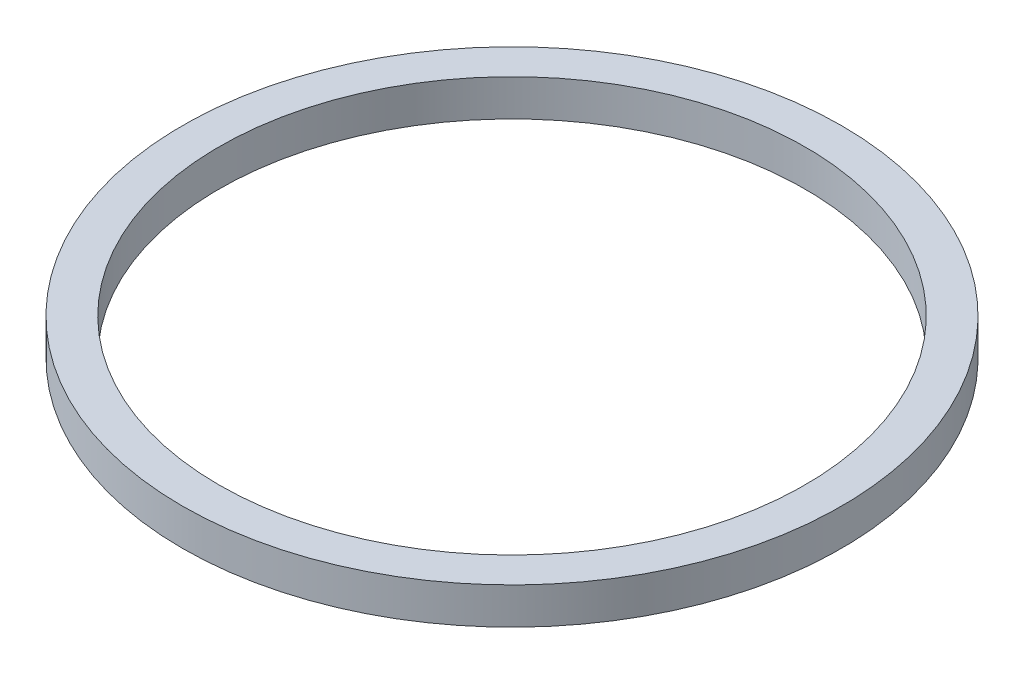
ISO-10303-21;
HEADER;
FILE_DESCRIPTION(('STEP AP214'),'2;1');
FILE_NAME('part.step','',(''),(''),'','','');
FILE_SCHEMA(('AUTOMOTIVE_DESIGN { 1 0 10303 214 1 1 1 1 }'));
ENDSEC;
DATA;
#1=APPLICATION_CONTEXT('core data for automotive mechanical design processes');
#2=APPLICATION_PROTOCOL_DEFINITION('international standard','automotive_design',2000,#1);
#3=PRODUCT_CONTEXT('',#1,'mechanical');
#4=PRODUCT('Part','Part','',(#3));
#5=PRODUCT_RELATED_PRODUCT_CATEGORY('part','',(#4));
#6=PRODUCT_DEFINITION_FORMATION('','',#4);
#7=PRODUCT_DEFINITION_CONTEXT('part definition',#1,'design');
#8=PRODUCT_DEFINITION('design','',#6,#7);
#9=PRODUCT_DEFINITION_SHAPE('','',#8);
#10=(LENGTH_UNIT() NAMED_UNIT(*) SI_UNIT(.MILLI.,.METRE.));
#11=(NAMED_UNIT(*) PLANE_ANGLE_UNIT() SI_UNIT($,.RADIAN.));
#12=(NAMED_UNIT(*) SI_UNIT($,.STERADIAN.) SOLID_ANGLE_UNIT());
#13=UNCERTAINTY_MEASURE_WITH_UNIT(LENGTH_MEASURE(1.E-05),#10,'distance_accuracy_value','');
#14=(GEOMETRIC_REPRESENTATION_CONTEXT(3) GLOBAL_UNCERTAINTY_ASSIGNED_CONTEXT((#13)) GLOBAL_UNIT_ASSIGNED_CONTEXT((#10,
#11,#12)) REPRESENTATION_CONTEXT('',''));
#15=CARTESIAN_POINT('',(0.,0.,0.));
#16=DIRECTION('',(0.,0.,1.));
#17=DIRECTION('',(1.,0.,0.));
#18=AXIS2_PLACEMENT_3D('',#15,#16,#17);
#19=CARTESIAN_POINT('',(0.,0.1,0.));
#20=DIRECTION('',(0.,1.,0.));
#21=DIRECTION('',(0.,0.,1.));
#22=AXIS2_PLACEMENT_3D('',#19,#20,#21);
#23=PLANE('',#22);
#24=CARTESIAN_POINT('',(0.,0.1,0.));
#25=DIRECTION('',(0.,1.,0.));
#26=DIRECTION('',(0.,0.,1.));
#27=AXIS2_PLACEMENT_3D('',#24,#25,#26);
#28=CIRCLE('',#27,0.9);
#29=CARTESIAN_POINT('',(0.,0.1,0.9));
#30=VERTEX_POINT('',#29);
#31=EDGE_CURVE('E10',#30,#30,#28,.T.);
#32=ORIENTED_EDGE('',*,*,#31,.T.);
#33=EDGE_LOOP('',(#32));
#34=FACE_BOUND('',#33,.T.);
#35=CARTESIAN_POINT('',(0.,0.1,0.));
#36=DIRECTION('',(0.,1.,0.));
#37=DIRECTION('',(0.,0.,1.));
#38=AXIS2_PLACEMENT_3D('',#35,#36,#37);
#39=CIRCLE('',#38,0.8);
#40=CARTESIAN_POINT('',(0.,0.1,0.8));
#41=VERTEX_POINT('',#40);
#42=EDGE_CURVE('E43',#41,#41,#39,.T.);
#43=ORIENTED_EDGE('',*,*,#42,.F.);
#44=EDGE_LOOP('',(#43));
#45=FACE_BOUND('',#44,.T.);
#46=ADVANCED_FACE('F32',(#34,#45),#23,.T.);
#47=CARTESIAN_POINT('',(0.,0.,0.));
#48=DIRECTION('',(0.,1.,0.));
#49=DIRECTION('',(0.,0.,1.));
#50=AXIS2_PLACEMENT_3D('',#47,#48,#49);
#51=PLANE('',#50);
#52=CARTESIAN_POINT('',(0.,0.,0.));
#53=DIRECTION('',(0.,1.,0.));
#54=DIRECTION('',(0.,0.,1.));
#55=AXIS2_PLACEMENT_3D('',#52,#53,#54);
#56=CIRCLE('',#55,0.9);
#57=CARTESIAN_POINT('',(0.,0.,0.9));
#58=VERTEX_POINT('',#57);
#59=EDGE_CURVE('E36',#58,#58,#56,.T.);
#60=ORIENTED_EDGE('',*,*,#59,.F.);
#61=EDGE_LOOP('',(#60));
#62=FACE_BOUND('',#61,.T.);
#63=CARTESIAN_POINT('',(0.,0.,0.));
#64=DIRECTION('',(0.,1.,0.));
#65=DIRECTION('',(0.,0.,1.));
#66=AXIS2_PLACEMENT_3D('',#63,#64,#65);
#67=CIRCLE('',#66,0.8);
#68=CARTESIAN_POINT('',(0.,0.,0.8));
#69=VERTEX_POINT('',#68);
#70=EDGE_CURVE('E45',#69,#69,#67,.T.);
#71=ORIENTED_EDGE('',*,*,#70,.T.);
#72=EDGE_LOOP('',(#71));
#73=FACE_BOUND('',#72,.T.);
#74=ADVANCED_FACE('F55',(#62,#73),#51,.F.);
#75=CARTESIAN_POINT('',(0.,0.1,0.));
#76=DIRECTION('',(0.,-1.,0.));
#77=DIRECTION('',(0.,0.,-1.));
#78=AXIS2_PLACEMENT_3D('',#75,#76,#77);
#79=CYLINDRICAL_SURFACE('',#78,0.9);
#80=ORIENTED_EDGE('',*,*,#31,.F.);
#81=EDGE_LOOP('',(#80));
#82=FACE_BOUND('',#81,.T.);
#83=ORIENTED_EDGE('',*,*,#59,.T.);
#84=EDGE_LOOP('',(#83));
#85=FACE_BOUND('',#84,.T.);
#86=ADVANCED_FACE('F34',(#82,#85),#79,.T.);
#87=CARTESIAN_POINT('',(0.,0.1,0.));
#88=DIRECTION('',(0.,-1.,0.));
#89=DIRECTION('',(0.,0.,-1.));
#90=AXIS2_PLACEMENT_3D('',#87,#88,#89);
#91=CYLINDRICAL_SURFACE('',#90,0.8);
#92=ORIENTED_EDGE('',*,*,#42,.T.);
#93=EDGE_LOOP('',(#92));
#94=FACE_BOUND('',#93,.T.);
#95=ORIENTED_EDGE('',*,*,#70,.F.);
#96=EDGE_LOOP('',(#95));
#97=FACE_BOUND('',#96,.T.);
#98=ADVANCED_FACE('F51',(#94,#97),#91,.F.);
#99=CLOSED_SHELL('',(#46,#74,#86,#98));
#100=MANIFOLD_SOLID_BREP('B2',#99);
#101=ADVANCED_BREP_SHAPE_REPRESENTATION('',(#18,#100),#14);
#102=SHAPE_DEFINITION_REPRESENTATION(#9,#101);
ENDSEC;
END-ISO-10303-21;
